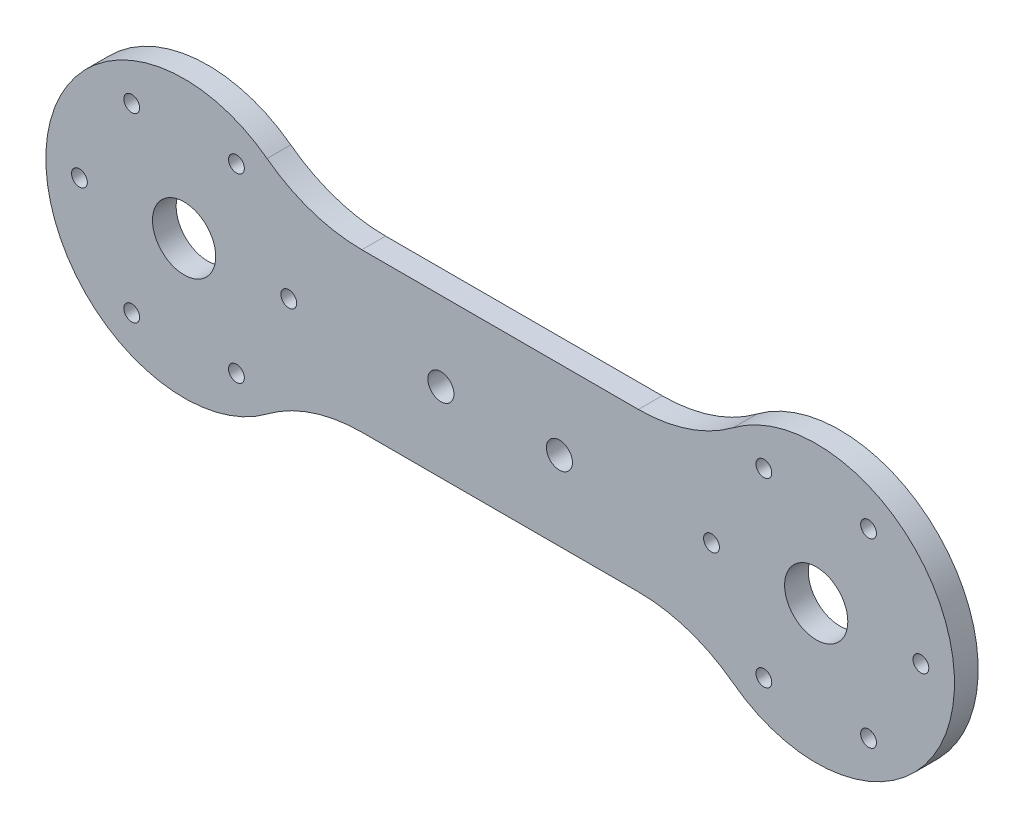
ISO-10303-21;
HEADER;
FILE_DESCRIPTION(('STEP AP214'),'2;1');
FILE_NAME('part.step','',(''),(''),'','','');
FILE_SCHEMA(('AUTOMOTIVE_DESIGN { 1 0 10303 214 1 1 1 1 }'));
ENDSEC;
DATA;
#1=APPLICATION_CONTEXT('core data for automotive mechanical design processes');
#2=APPLICATION_PROTOCOL_DEFINITION('international standard','automotive_design',2000,#1);
#3=PRODUCT_CONTEXT('',#1,'mechanical');
#4=PRODUCT('Part','Part','',(#3));
#5=PRODUCT_RELATED_PRODUCT_CATEGORY('part','',(#4));
#6=PRODUCT_DEFINITION_FORMATION('','',#4);
#7=PRODUCT_DEFINITION_CONTEXT('part definition',#1,'design');
#8=PRODUCT_DEFINITION('design','',#6,#7);
#9=PRODUCT_DEFINITION_SHAPE('','',#8);
#10=(LENGTH_UNIT() NAMED_UNIT(*) SI_UNIT(.MILLI.,.METRE.));
#11=(NAMED_UNIT(*) PLANE_ANGLE_UNIT() SI_UNIT($,.RADIAN.));
#12=(NAMED_UNIT(*) SI_UNIT($,.STERADIAN.) SOLID_ANGLE_UNIT());
#13=UNCERTAINTY_MEASURE_WITH_UNIT(LENGTH_MEASURE(1.E-05),#10,'distance_accuracy_value','');
#14=(GEOMETRIC_REPRESENTATION_CONTEXT(3) GLOBAL_UNCERTAINTY_ASSIGNED_CONTEXT((#13)) GLOBAL_UNIT_ASSIGNED_CONTEXT((#10,
#11,#12)) REPRESENTATION_CONTEXT('',''));
#15=CARTESIAN_POINT('',(0.,0.,0.));
#16=DIRECTION('',(0.,0.,1.));
#17=DIRECTION('',(1.,0.,0.));
#18=AXIS2_PLACEMENT_3D('',#15,#16,#17);
#19=CARTESIAN_POINT('',(80.,0.,3.));
#20=DIRECTION('',(0.,0.,-1.));
#21=DIRECTION('',(-1.,0.,0.));
#22=AXIS2_PLACEMENT_3D('',#19,#20,#21);
#23=CYLINDRICAL_SURFACE('',#22,17.5);
#24=CARTESIAN_POINT('',(80.,0.,3.));
#25=DIRECTION('',(0.,0.,1.));
#26=DIRECTION('',(1.,0.,0.));
#27=AXIS2_PLACEMENT_3D('',#24,#25,#26);
#28=CIRCLE('',#27,17.5);
#29=CARTESIAN_POINT('',(69.5,14.,3.));
#30=VERTEX_POINT('',#29);
#31=CARTESIAN_POINT('',(69.5,-14.,3.));
#32=VERTEX_POINT('',#31);
#33=EDGE_CURVE('E174',#30,#32,#28,.F.);
#34=ORIENTED_EDGE('',*,*,#33,.T.);
#35=DIRECTION('',(0.,0.,-1.));
#36=VECTOR('',#35,1.);
#37=CARTESIAN_POINT('',(69.5,-14.,3.));
#38=LINE('',#37,#36);
#39=CARTESIAN_POINT('',(69.5,-14.,0.));
#40=VERTEX_POINT('',#39);
#41=EDGE_CURVE('E146',#32,#40,#38,.T.);
#42=ORIENTED_EDGE('',*,*,#41,.T.);
#43=CARTESIAN_POINT('',(80.,0.,0.));
#44=DIRECTION('',(0.,0.,1.));
#45=DIRECTION('',(1.,0.,0.));
#46=AXIS2_PLACEMENT_3D('',#43,#44,#45);
#47=CIRCLE('',#46,17.5);
#48=CARTESIAN_POINT('',(69.5,14.,0.));
#49=VERTEX_POINT('',#48);
#50=EDGE_CURVE('E162',#49,#40,#47,.F.);
#51=ORIENTED_EDGE('',*,*,#50,.F.);
#52=DIRECTION('',(0.,0.,-1.));
#53=VECTOR('',#52,1.);
#54=CARTESIAN_POINT('',(69.5,14.,3.));
#55=LINE('',#54,#53);
#56=EDGE_CURVE('E144',#49,#30,#55,.F.);
#57=ORIENTED_EDGE('',*,*,#56,.T.);
#58=EDGE_LOOP('',(#34,#42,#51,#57));
#59=FACE_BOUND('',#58,.T.);
#60=ADVANCED_FACE('F34',(#59),#23,.T.);
#61=CARTESIAN_POINT('',(0.,10.,3.));
#62=DIRECTION('',(0.,1.,0.));
#63=DIRECTION('',(0.,0.,1.));
#64=AXIS2_PLACEMENT_3D('',#61,#62,#63);
#65=PLANE('',#64);
#66=DIRECTION('',(1.,0.,0.));
#67=VECTOR('',#66,1.);
#68=CARTESIAN_POINT('',(0.,10.,3.));
#69=LINE('',#68,#67);
#70=CARTESIAN_POINT('',(22.5,10.,3.));
#71=VERTEX_POINT('',#70);
#72=CARTESIAN_POINT('',(57.5,10.,3.));
#73=VERTEX_POINT('',#72);
#74=EDGE_CURVE('E169',#71,#73,#69,.T.);
#75=ORIENTED_EDGE('',*,*,#74,.T.);
#76=DIRECTION('',(0.,0.,1.));
#77=VECTOR('',#76,1.);
#78=CARTESIAN_POINT('',(57.5,10.,0.));
#79=LINE('',#78,#77);
#80=CARTESIAN_POINT('',(57.5,10.,0.));
#81=VERTEX_POINT('',#80);
#82=EDGE_CURVE('E111',#73,#81,#79,.F.);
#83=ORIENTED_EDGE('',*,*,#82,.T.);
#84=DIRECTION('',(1.,0.,0.));
#85=VECTOR('',#84,1.);
#86=CARTESIAN_POINT('',(0.,10.,0.));
#87=LINE('',#86,#85);
#88=CARTESIAN_POINT('',(22.5,10.,0.));
#89=VERTEX_POINT('',#88);
#90=EDGE_CURVE('E135',#89,#81,#87,.T.);
#91=ORIENTED_EDGE('',*,*,#90,.F.);
#92=DIRECTION('',(0.,0.,-1.));
#93=VECTOR('',#92,1.);
#94=CARTESIAN_POINT('',(22.5,10.,3.));
#95=LINE('',#94,#93);
#96=EDGE_CURVE('E56',#89,#71,#95,.F.);
#97=ORIENTED_EDGE('',*,*,#96,.T.);
#98=EDGE_LOOP('',(#75,#83,#91,#97));
#99=FACE_BOUND('',#98,.T.);
#100=ADVANCED_FACE('F160',(#99),#65,.T.);
#101=CARTESIAN_POINT('',(0.,0.,3.));
#102=DIRECTION('',(0.,0.,-1.));
#103=DIRECTION('',(-1.,0.,0.));
#104=AXIS2_PLACEMENT_3D('',#101,#102,#103);
#105=CYLINDRICAL_SURFACE('',#104,17.5);
#106=CARTESIAN_POINT('',(0.,0.,0.));
#107=DIRECTION('',(0.,0.,1.));
#108=DIRECTION('',(1.,0.,0.));
#109=AXIS2_PLACEMENT_3D('',#106,#107,#108);
#110=CIRCLE('',#109,17.5);
#111=CARTESIAN_POINT('',(10.5,14.,0.));
#112=VERTEX_POINT('',#111);
#113=CARTESIAN_POINT('',(10.5,-14.,0.));
#114=VERTEX_POINT('',#113);
#115=EDGE_CURVE('E130',#112,#114,#110,.T.);
#116=ORIENTED_EDGE('',*,*,#115,.T.);
#117=DIRECTION('',(0.,0.,-1.));
#118=VECTOR('',#117,1.);
#119=CARTESIAN_POINT('',(10.5,-14.,3.));
#120=LINE('',#119,#118);
#121=CARTESIAN_POINT('',(10.5,-14.,3.));
#122=VERTEX_POINT('',#121);
#123=EDGE_CURVE('E105',#114,#122,#120,.F.);
#124=ORIENTED_EDGE('',*,*,#123,.T.);
#125=CARTESIAN_POINT('',(0.,0.,3.));
#126=DIRECTION('',(0.,0.,1.));
#127=DIRECTION('',(1.,0.,0.));
#128=AXIS2_PLACEMENT_3D('',#125,#126,#127);
#129=CIRCLE('',#128,17.5);
#130=CARTESIAN_POINT('',(10.5,14.,3.));
#131=VERTEX_POINT('',#130);
#132=EDGE_CURVE('E168',#131,#122,#129,.T.);
#133=ORIENTED_EDGE('',*,*,#132,.F.);
#134=DIRECTION('',(0.,0.,-1.));
#135=VECTOR('',#134,1.);
#136=CARTESIAN_POINT('',(10.5,14.,3.));
#137=LINE('',#136,#135);
#138=EDGE_CURVE('E121',#131,#112,#137,.T.);
#139=ORIENTED_EDGE('',*,*,#138,.T.);
#140=EDGE_LOOP('',(#116,#124,#133,#139));
#141=FACE_BOUND('',#140,.T.);
#142=ADVANCED_FACE('F171',(#141),#105,.T.);
#143=CARTESIAN_POINT('',(0.,-10.,3.));
#144=DIRECTION('',(0.,1.,0.));
#145=DIRECTION('',(0.,0.,1.));
#146=AXIS2_PLACEMENT_3D('',#143,#144,#145);
#147=PLANE('',#146);
#148=DIRECTION('',(1.,0.,0.));
#149=VECTOR('',#148,1.);
#150=CARTESIAN_POINT('',(0.,-10.,3.));
#151=LINE('',#150,#149);
#152=CARTESIAN_POINT('',(22.5,-10.,3.));
#153=VERTEX_POINT('',#152);
#154=CARTESIAN_POINT('',(57.5,-10.,3.));
#155=VERTEX_POINT('',#154);
#156=EDGE_CURVE('E120',#153,#155,#151,.T.);
#157=ORIENTED_EDGE('',*,*,#156,.F.);
#158=DIRECTION('',(0.,0.,1.));
#159=VECTOR('',#158,1.);
#160=CARTESIAN_POINT('',(22.5,-10.,0.));
#161=LINE('',#160,#159);
#162=CARTESIAN_POINT('',(22.5,-10.,0.));
#163=VERTEX_POINT('',#162);
#164=EDGE_CURVE('E104',#153,#163,#161,.F.);
#165=ORIENTED_EDGE('',*,*,#164,.T.);
#166=DIRECTION('',(1.,0.,0.));
#167=VECTOR('',#166,1.);
#168=CARTESIAN_POINT('',(0.,-10.,0.));
#169=LINE('',#168,#167);
#170=CARTESIAN_POINT('',(57.5,-10.,0.));
#171=VERTEX_POINT('',#170);
#172=EDGE_CURVE('E117',#163,#171,#169,.T.);
#173=ORIENTED_EDGE('',*,*,#172,.T.);
#174=DIRECTION('',(0.,0.,-1.));
#175=VECTOR('',#174,1.);
#176=CARTESIAN_POINT('',(57.5,-10.,3.));
#177=LINE('',#176,#175);
#178=EDGE_CURVE('E122',#171,#155,#177,.F.);
#179=ORIENTED_EDGE('',*,*,#178,.T.);
#180=EDGE_LOOP('',(#157,#165,#173,#179));
#181=FACE_BOUND('',#180,.T.);
#182=ADVANCED_FACE('F116',(#181),#147,.F.);
#183=CARTESIAN_POINT('',(73.375,11.4748366001438,3.));
#184=DIRECTION('',(0.,0.,-1.));
#185=DIRECTION('',(-1.,0.,0.));
#186=AXIS2_PLACEMENT_3D('',#183,#184,#185);
#187=CYLINDRICAL_SURFACE('',#186,0.999999999999993);
#188=CARTESIAN_POINT('',(73.375,11.4748366001438,3.));
#189=DIRECTION('',(0.,0.,1.));
#190=DIRECTION('',(1.,0.,0.));
#191=AXIS2_PLACEMENT_3D('',#188,#189,#190);
#192=CIRCLE('',#191,0.999999999999993);
#193=CARTESIAN_POINT('',(74.3749999999999,11.4748366001438,3.));
#194=VERTEX_POINT('',#193);
#195=EDGE_CURVE('E608',#194,#194,#192,.F.);
#196=ORIENTED_EDGE('',*,*,#195,.F.);
#197=EDGE_LOOP('',(#196));
#198=FACE_BOUND('',#197,.T.);
#199=CARTESIAN_POINT('',(73.375,11.4748366001438,0.));
#200=DIRECTION('',(0.,0.,1.));
#201=DIRECTION('',(1.,0.,0.));
#202=AXIS2_PLACEMENT_3D('',#199,#200,#201);
#203=CIRCLE('',#202,0.999999999999993);
#204=CARTESIAN_POINT('',(74.3749999999999,11.4748366001438,0.));
#205=VERTEX_POINT('',#204);
#206=EDGE_CURVE('E222',#205,#205,#203,.F.);
#207=ORIENTED_EDGE('',*,*,#206,.T.);
#208=EDGE_LOOP('',(#207));
#209=FACE_BOUND('',#208,.T.);
#210=ADVANCED_FACE('F248',(#198,#209),#187,.F.);
#211=CARTESIAN_POINT('',(73.3750000000001,-11.4748366001439,3.));
#212=DIRECTION('',(0.,0.,-1.));
#213=DIRECTION('',(-1.,0.,0.));
#214=AXIS2_PLACEMENT_3D('',#211,#212,#213);
#215=CYLINDRICAL_SURFACE('',#214,0.999999999999993);
#216=CARTESIAN_POINT('',(73.3750000000001,-11.4748366001439,3.));
#217=DIRECTION('',(0.,0.,1.));
#218=DIRECTION('',(1.,0.,0.));
#219=AXIS2_PLACEMENT_3D('',#216,#217,#218);
#220=CIRCLE('',#219,0.999999999999993);
#221=CARTESIAN_POINT('',(74.3750000000001,-11.4748366001439,3.));
#222=VERTEX_POINT('',#221);
#223=EDGE_CURVE('E605',#222,#222,#220,.F.);
#224=ORIENTED_EDGE('',*,*,#223,.F.);
#225=EDGE_LOOP('',(#224));
#226=FACE_BOUND('',#225,.T.);
#227=CARTESIAN_POINT('',(73.3750000000001,-11.4748366001439,0.));
#228=DIRECTION('',(0.,0.,1.));
#229=DIRECTION('',(1.,0.,0.));
#230=AXIS2_PLACEMENT_3D('',#227,#228,#229);
#231=CIRCLE('',#230,0.999999999999993);
#232=CARTESIAN_POINT('',(74.3750000000001,-11.4748366001439,0.));
#233=VERTEX_POINT('',#232);
#234=EDGE_CURVE('E219',#233,#233,#231,.F.);
#235=ORIENTED_EDGE('',*,*,#234,.T.);
#236=EDGE_LOOP('',(#235));
#237=FACE_BOUND('',#236,.T.);
#238=ADVANCED_FACE('F251',(#226,#237),#215,.F.);
#239=CARTESIAN_POINT('',(-6.62500000000014,-11.4748366001437,3.));
#240=DIRECTION('',(0.,0.,-1.));
#241=DIRECTION('',(-1.,0.,0.));
#242=AXIS2_PLACEMENT_3D('',#239,#240,#241);
#243=CYLINDRICAL_SURFACE('',#242,0.999999999999995);
#244=CARTESIAN_POINT('',(-6.62500000000014,-11.4748366001437,3.));
#245=DIRECTION('',(0.,0.,1.));
#246=DIRECTION('',(1.,0.,0.));
#247=AXIS2_PLACEMENT_3D('',#244,#245,#246);
#248=CIRCLE('',#247,0.999999999999995);
#249=CARTESIAN_POINT('',(-5.62500000000014,-11.4748366001437,3.));
#250=VERTEX_POINT('',#249);
#251=EDGE_CURVE('E601',#250,#250,#248,.T.);
#252=ORIENTED_EDGE('',*,*,#251,.T.);
#253=EDGE_LOOP('',(#252));
#254=FACE_BOUND('',#253,.T.);
#255=CARTESIAN_POINT('',(-6.62500000000014,-11.4748366001437,0.));
#256=DIRECTION('',(0.,0.,1.));
#257=DIRECTION('',(1.,0.,0.));
#258=AXIS2_PLACEMENT_3D('',#255,#256,#257);
#259=CIRCLE('',#258,0.999999999999995);
#260=CARTESIAN_POINT('',(-5.62500000000014,-11.4748366001437,0.));
#261=VERTEX_POINT('',#260);
#262=EDGE_CURVE('E216',#261,#261,#259,.T.);
#263=ORIENTED_EDGE('',*,*,#262,.F.);
#264=EDGE_LOOP('',(#263));
#265=FACE_BOUND('',#264,.T.);
#266=ADVANCED_FACE('F255',(#254,#265),#243,.F.);
#267=CARTESIAN_POINT('',(6.62499999999989,-11.4748366001439,3.));
#268=DIRECTION('',(0.,0.,-1.));
#269=DIRECTION('',(-1.,0.,0.));
#270=AXIS2_PLACEMENT_3D('',#267,#268,#269);
#271=CYLINDRICAL_SURFACE('',#270,0.999999999999998);
#272=CARTESIAN_POINT('',(6.62499999999989,-11.4748366001439,3.));
#273=DIRECTION('',(0.,0.,1.));
#274=DIRECTION('',(1.,0.,0.));
#275=AXIS2_PLACEMENT_3D('',#272,#273,#274);
#276=CIRCLE('',#275,0.999999999999998);
#277=CARTESIAN_POINT('',(7.62499999999989,-11.4748366001439,3.));
#278=VERTEX_POINT('',#277);
#279=EDGE_CURVE('E597',#278,#278,#276,.T.);
#280=ORIENTED_EDGE('',*,*,#279,.T.);
#281=EDGE_LOOP('',(#280));
#282=FACE_BOUND('',#281,.T.);
#283=CARTESIAN_POINT('',(6.62499999999989,-11.4748366001439,0.));
#284=DIRECTION('',(0.,0.,1.));
#285=DIRECTION('',(1.,0.,0.));
#286=AXIS2_PLACEMENT_3D('',#283,#284,#285);
#287=CIRCLE('',#286,0.999999999999998);
#288=CARTESIAN_POINT('',(7.62499999999989,-11.4748366001439,0.));
#289=VERTEX_POINT('',#288);
#290=EDGE_CURVE('E213',#289,#289,#287,.T.);
#291=ORIENTED_EDGE('',*,*,#290,.F.);
#292=EDGE_LOOP('',(#291));
#293=FACE_BOUND('',#292,.T.);
#294=ADVANCED_FACE('F259',(#282,#293),#271,.F.);
#295=CARTESIAN_POINT('',(13.25,0.,3.));
#296=DIRECTION('',(0.,0.,-1.));
#297=DIRECTION('',(-1.,0.,0.));
#298=AXIS2_PLACEMENT_3D('',#295,#296,#297);
#299=CYLINDRICAL_SURFACE('',#298,0.999999999999998);
#300=CARTESIAN_POINT('',(13.25,0.,3.));
#301=DIRECTION('',(0.,0.,1.));
#302=DIRECTION('',(1.,0.,0.));
#303=AXIS2_PLACEMENT_3D('',#300,#301,#302);
#304=CIRCLE('',#303,0.999999999999998);
#305=CARTESIAN_POINT('',(14.25,0.,3.));
#306=VERTEX_POINT('',#305);
#307=EDGE_CURVE('E593',#306,#306,#304,.T.);
#308=ORIENTED_EDGE('',*,*,#307,.T.);
#309=EDGE_LOOP('',(#308));
#310=FACE_BOUND('',#309,.T.);
#311=CARTESIAN_POINT('',(13.25,0.,0.));
#312=DIRECTION('',(0.,0.,1.));
#313=DIRECTION('',(1.,0.,0.));
#314=AXIS2_PLACEMENT_3D('',#311,#312,#313);
#315=CIRCLE('',#314,0.999999999999998);
#316=CARTESIAN_POINT('',(14.25,0.,0.));
#317=VERTEX_POINT('',#316);
#318=EDGE_CURVE('E210',#317,#317,#315,.T.);
#319=ORIENTED_EDGE('',*,*,#318,.F.);
#320=EDGE_LOOP('',(#319));
#321=FACE_BOUND('',#320,.T.);
#322=ADVANCED_FACE('F263',(#310,#321),#299,.F.);
#323=CARTESIAN_POINT('',(86.6250000000001,-11.4748366001437,3.));
#324=DIRECTION('',(0.,0.,-1.));
#325=DIRECTION('',(-1.,0.,0.));
#326=AXIS2_PLACEMENT_3D('',#323,#324,#325);
#327=CYLINDRICAL_SURFACE('',#326,0.999999999999999);
#328=CARTESIAN_POINT('',(86.6250000000001,-11.4748366001437,3.));
#329=DIRECTION('',(0.,0.,1.));
#330=DIRECTION('',(1.,0.,0.));
#331=AXIS2_PLACEMENT_3D('',#328,#329,#330);
#332=CIRCLE('',#331,0.999999999999999);
#333=CARTESIAN_POINT('',(87.6250000000001,-11.4748366001437,3.));
#334=VERTEX_POINT('',#333);
#335=EDGE_CURVE('E589',#334,#334,#332,.F.);
#336=ORIENTED_EDGE('',*,*,#335,.F.);
#337=EDGE_LOOP('',(#336));
#338=FACE_BOUND('',#337,.T.);
#339=CARTESIAN_POINT('',(86.6250000000001,-11.4748366001437,0.));
#340=DIRECTION('',(0.,0.,1.));
#341=DIRECTION('',(1.,0.,0.));
#342=AXIS2_PLACEMENT_3D('',#339,#340,#341);
#343=CIRCLE('',#342,0.999999999999999);
#344=CARTESIAN_POINT('',(87.6250000000001,-11.4748366001437,0.));
#345=VERTEX_POINT('',#344);
#346=EDGE_CURVE('E207',#345,#345,#343,.F.);
#347=ORIENTED_EDGE('',*,*,#346,.T.);
#348=EDGE_LOOP('',(#347));
#349=FACE_BOUND('',#348,.T.);
#350=ADVANCED_FACE('F267',(#338,#349),#327,.F.);
#351=CARTESIAN_POINT('',(-6.62499999999997,11.4748366001438,3.));
#352=DIRECTION('',(0.,0.,-1.));
#353=DIRECTION('',(-1.,0.,0.));
#354=AXIS2_PLACEMENT_3D('',#351,#352,#353);
#355=CYLINDRICAL_SURFACE('',#354,0.999999999999999);
#356=CARTESIAN_POINT('',(-6.62499999999997,11.4748366001438,3.));
#357=DIRECTION('',(0.,0.,1.));
#358=DIRECTION('',(1.,0.,0.));
#359=AXIS2_PLACEMENT_3D('',#356,#357,#358);
#360=CIRCLE('',#359,0.999999999999999);
#361=CARTESIAN_POINT('',(-5.62499999999997,11.4748366001438,3.));
#362=VERTEX_POINT('',#361);
#363=EDGE_CURVE('E585',#362,#362,#360,.T.);
#364=ORIENTED_EDGE('',*,*,#363,.T.);
#365=EDGE_LOOP('',(#364));
#366=FACE_BOUND('',#365,.T.);
#367=CARTESIAN_POINT('',(-6.62499999999997,11.4748366001438,0.));
#368=DIRECTION('',(0.,0.,1.));
#369=DIRECTION('',(1.,0.,0.));
#370=AXIS2_PLACEMENT_3D('',#367,#368,#369);
#371=CIRCLE('',#370,0.999999999999999);
#372=CARTESIAN_POINT('',(-5.62499999999997,11.4748366001438,0.));
#373=VERTEX_POINT('',#372);
#374=EDGE_CURVE('E204',#373,#373,#371,.T.);
#375=ORIENTED_EDGE('',*,*,#374,.F.);
#376=EDGE_LOOP('',(#375));
#377=FACE_BOUND('',#376,.T.);
#378=ADVANCED_FACE('F271',(#366,#377),#355,.F.);
#379=CARTESIAN_POINT('',(-13.25,0.,3.));
#380=DIRECTION('',(0.,0.,-1.));
#381=DIRECTION('',(-1.,0.,0.));
#382=AXIS2_PLACEMENT_3D('',#379,#380,#381);
#383=CYLINDRICAL_SURFACE('',#382,0.999999999999998);
#384=CARTESIAN_POINT('',(-13.25,0.,3.));
#385=DIRECTION('',(0.,0.,1.));
#386=DIRECTION('',(1.,0.,0.));
#387=AXIS2_PLACEMENT_3D('',#384,#385,#386);
#388=CIRCLE('',#387,0.999999999999998);
#389=CARTESIAN_POINT('',(-12.25,0.,3.));
#390=VERTEX_POINT('',#389);
#391=EDGE_CURVE('E581',#390,#390,#388,.T.);
#392=ORIENTED_EDGE('',*,*,#391,.T.);
#393=EDGE_LOOP('',(#392));
#394=FACE_BOUND('',#393,.T.);
#395=CARTESIAN_POINT('',(-13.25,0.,0.));
#396=DIRECTION('',(0.,0.,1.));
#397=DIRECTION('',(1.,0.,0.));
#398=AXIS2_PLACEMENT_3D('',#395,#396,#397);
#399=CIRCLE('',#398,0.999999999999998);
#400=CARTESIAN_POINT('',(-12.25,0.,0.));
#401=VERTEX_POINT('',#400);
#402=EDGE_CURVE('E201',#401,#401,#399,.T.);
#403=ORIENTED_EDGE('',*,*,#402,.F.);
#404=EDGE_LOOP('',(#403));
#405=FACE_BOUND('',#404,.T.);
#406=ADVANCED_FACE('F275',(#394,#405),#383,.F.);
#407=CARTESIAN_POINT('',(0.,0.,3.));
#408=DIRECTION('',(0.,0.,-1.));
#409=DIRECTION('',(-1.,0.,0.));
#410=AXIS2_PLACEMENT_3D('',#407,#408,#409);
#411=CYLINDRICAL_SURFACE('',#410,4.);
#412=CARTESIAN_POINT('',(0.,0.,3.));
#413=DIRECTION('',(0.,0.,1.));
#414=DIRECTION('',(1.,0.,0.));
#415=AXIS2_PLACEMENT_3D('',#412,#413,#414);
#416=CIRCLE('',#415,4.);
#417=CARTESIAN_POINT('',(4.,0.,3.));
#418=VERTEX_POINT('',#417);
#419=EDGE_CURVE('E577',#418,#418,#416,.T.);
#420=ORIENTED_EDGE('',*,*,#419,.T.);
#421=EDGE_LOOP('',(#420));
#422=FACE_BOUND('',#421,.T.);
#423=CARTESIAN_POINT('',(0.,0.,0.));
#424=DIRECTION('',(0.,0.,1.));
#425=DIRECTION('',(1.,0.,0.));
#426=AXIS2_PLACEMENT_3D('',#423,#424,#425);
#427=CIRCLE('',#426,4.);
#428=CARTESIAN_POINT('',(4.,0.,0.));
#429=VERTEX_POINT('',#428);
#430=EDGE_CURVE('E198',#429,#429,#427,.T.);
#431=ORIENTED_EDGE('',*,*,#430,.F.);
#432=EDGE_LOOP('',(#431));
#433=FACE_BOUND('',#432,.T.);
#434=ADVANCED_FACE('F279',(#422,#433),#411,.F.);
#435=CARTESIAN_POINT('',(6.62500000000006,11.4748366001438,3.));
#436=DIRECTION('',(0.,0.,-1.));
#437=DIRECTION('',(-1.,0.,0.));
#438=AXIS2_PLACEMENT_3D('',#435,#436,#437);
#439=CYLINDRICAL_SURFACE('',#438,0.999999999999997);
#440=CARTESIAN_POINT('',(6.62500000000006,11.4748366001438,3.));
#441=DIRECTION('',(0.,0.,1.));
#442=DIRECTION('',(1.,0.,0.));
#443=AXIS2_PLACEMENT_3D('',#440,#441,#442);
#444=CIRCLE('',#443,0.999999999999997);
#445=CARTESIAN_POINT('',(7.62500000000005,11.4748366001438,3.));
#446=VERTEX_POINT('',#445);
#447=EDGE_CURVE('E573',#446,#446,#444,.T.);
#448=ORIENTED_EDGE('',*,*,#447,.T.);
#449=EDGE_LOOP('',(#448));
#450=FACE_BOUND('',#449,.T.);
#451=CARTESIAN_POINT('',(6.62500000000006,11.4748366001438,0.));
#452=DIRECTION('',(0.,0.,1.));
#453=DIRECTION('',(1.,0.,0.));
#454=AXIS2_PLACEMENT_3D('',#451,#452,#453);
#455=CIRCLE('',#454,0.999999999999997);
#456=CARTESIAN_POINT('',(7.62500000000005,11.4748366001438,0.));
#457=VERTEX_POINT('',#456);
#458=EDGE_CURVE('E195',#457,#457,#455,.T.);
#459=ORIENTED_EDGE('',*,*,#458,.F.);
#460=EDGE_LOOP('',(#459));
#461=FACE_BOUND('',#460,.T.);
#462=ADVANCED_FACE('F283',(#450,#461),#439,.F.);
#463=CARTESIAN_POINT('',(80.,0.,3.));
#464=DIRECTION('',(0.,0.,-1.));
#465=DIRECTION('',(-1.,0.,0.));
#466=AXIS2_PLACEMENT_3D('',#463,#464,#465);
#467=CYLINDRICAL_SURFACE('',#466,4.);
#468=CARTESIAN_POINT('',(80.,0.,3.));
#469=DIRECTION('',(0.,0.,1.));
#470=DIRECTION('',(1.,0.,0.));
#471=AXIS2_PLACEMENT_3D('',#468,#469,#470);
#472=CIRCLE('',#471,4.);
#473=CARTESIAN_POINT('',(84.,0.,3.));
#474=VERTEX_POINT('',#473);
#475=EDGE_CURVE('E569',#474,#474,#472,.F.);
#476=ORIENTED_EDGE('',*,*,#475,.F.);
#477=EDGE_LOOP('',(#476));
#478=FACE_BOUND('',#477,.T.);
#479=CARTESIAN_POINT('',(80.,0.,0.));
#480=DIRECTION('',(0.,0.,1.));
#481=DIRECTION('',(1.,0.,0.));
#482=AXIS2_PLACEMENT_3D('',#479,#480,#481);
#483=CIRCLE('',#482,4.);
#484=CARTESIAN_POINT('',(84.,0.,0.));
#485=VERTEX_POINT('',#484);
#486=EDGE_CURVE('E192',#485,#485,#483,.F.);
#487=ORIENTED_EDGE('',*,*,#486,.T.);
#488=EDGE_LOOP('',(#487));
#489=FACE_BOUND('',#488,.T.);
#490=ADVANCED_FACE('F287',(#478,#489),#467,.F.);
#491=CARTESIAN_POINT('',(66.75,0.,3.));
#492=DIRECTION('',(0.,0.,-1.));
#493=DIRECTION('',(-1.,0.,0.));
#494=AXIS2_PLACEMENT_3D('',#491,#492,#493);
#495=CYLINDRICAL_SURFACE('',#494,0.999999999999996);
#496=CARTESIAN_POINT('',(66.75,0.,3.));
#497=DIRECTION('',(0.,0.,1.));
#498=DIRECTION('',(1.,0.,0.));
#499=AXIS2_PLACEMENT_3D('',#496,#497,#498);
#500=CIRCLE('',#499,0.999999999999996);
#501=CARTESIAN_POINT('',(67.75,0.,3.));
#502=VERTEX_POINT('',#501);
#503=EDGE_CURVE('E565',#502,#502,#500,.F.);
#504=ORIENTED_EDGE('',*,*,#503,.F.);
#505=EDGE_LOOP('',(#504));
#506=FACE_BOUND('',#505,.T.);
#507=CARTESIAN_POINT('',(66.75,0.,0.));
#508=DIRECTION('',(0.,0.,1.));
#509=DIRECTION('',(1.,0.,0.));
#510=AXIS2_PLACEMENT_3D('',#507,#508,#509);
#511=CIRCLE('',#510,0.999999999999996);
#512=CARTESIAN_POINT('',(67.75,0.,0.));
#513=VERTEX_POINT('',#512);
#514=EDGE_CURVE('E189',#513,#513,#511,.F.);
#515=ORIENTED_EDGE('',*,*,#514,.T.);
#516=EDGE_LOOP('',(#515));
#517=FACE_BOUND('',#516,.T.);
#518=ADVANCED_FACE('F291',(#506,#517),#495,.F.);
#519=CARTESIAN_POINT('',(86.625,11.4748366001438,3.));
#520=DIRECTION('',(0.,0.,-1.));
#521=DIRECTION('',(-1.,0.,0.));
#522=AXIS2_PLACEMENT_3D('',#519,#520,#521);
#523=CYLINDRICAL_SURFACE('',#522,0.99999999999999);
#524=CARTESIAN_POINT('',(86.625,11.4748366001438,3.));
#525=DIRECTION('',(0.,0.,1.));
#526=DIRECTION('',(1.,0.,0.));
#527=AXIS2_PLACEMENT_3D('',#524,#525,#526);
#528=CIRCLE('',#527,0.99999999999999);
#529=CARTESIAN_POINT('',(87.625,11.4748366001438,3.));
#530=VERTEX_POINT('',#529);
#531=EDGE_CURVE('E561',#530,#530,#528,.F.);
#532=ORIENTED_EDGE('',*,*,#531,.F.);
#533=EDGE_LOOP('',(#532));
#534=FACE_BOUND('',#533,.T.);
#535=CARTESIAN_POINT('',(86.625,11.4748366001438,0.));
#536=DIRECTION('',(0.,0.,1.));
#537=DIRECTION('',(1.,0.,0.));
#538=AXIS2_PLACEMENT_3D('',#535,#536,#537);
#539=CIRCLE('',#538,0.99999999999999);
#540=CARTESIAN_POINT('',(87.625,11.4748366001438,0.));
#541=VERTEX_POINT('',#540);
#542=EDGE_CURVE('E186',#541,#541,#539,.F.);
#543=ORIENTED_EDGE('',*,*,#542,.T.);
#544=EDGE_LOOP('',(#543));
#545=FACE_BOUND('',#544,.T.);
#546=ADVANCED_FACE('F295',(#534,#545),#523,.F.);
#547=CARTESIAN_POINT('',(32.5,0.,3.));
#548=DIRECTION('',(0.,0.,-1.));
#549=DIRECTION('',(-1.,0.,0.));
#550=AXIS2_PLACEMENT_3D('',#547,#548,#549);
#551=CYLINDRICAL_SURFACE('',#550,1.65);
#552=CARTESIAN_POINT('',(32.5,0.,3.));
#553=DIRECTION('',(0.,0.,1.));
#554=DIRECTION('',(1.,0.,0.));
#555=AXIS2_PLACEMENT_3D('',#552,#553,#554);
#556=CIRCLE('',#555,1.65);
#557=CARTESIAN_POINT('',(34.15,0.,3.));
#558=VERTEX_POINT('',#557);
#559=EDGE_CURVE('E557',#558,#558,#556,.T.);
#560=ORIENTED_EDGE('',*,*,#559,.T.);
#561=EDGE_LOOP('',(#560));
#562=FACE_BOUND('',#561,.T.);
#563=CARTESIAN_POINT('',(32.5,0.,0.));
#564=DIRECTION('',(0.,0.,1.));
#565=DIRECTION('',(1.,0.,0.));
#566=AXIS2_PLACEMENT_3D('',#563,#564,#565);
#567=CIRCLE('',#566,1.65);
#568=CARTESIAN_POINT('',(34.15,0.,0.));
#569=VERTEX_POINT('',#568);
#570=EDGE_CURVE('E183',#569,#569,#567,.T.);
#571=ORIENTED_EDGE('',*,*,#570,.F.);
#572=EDGE_LOOP('',(#571));
#573=FACE_BOUND('',#572,.T.);
#574=ADVANCED_FACE('F299',(#562,#573),#551,.F.);
#575=CARTESIAN_POINT('',(47.5,0.,3.));
#576=DIRECTION('',(0.,0.,-1.));
#577=DIRECTION('',(-1.,0.,0.));
#578=AXIS2_PLACEMENT_3D('',#575,#576,#577);
#579=CYLINDRICAL_SURFACE('',#578,1.65);
#580=CARTESIAN_POINT('',(47.5,0.,3.));
#581=DIRECTION('',(0.,0.,1.));
#582=DIRECTION('',(1.,0.,0.));
#583=AXIS2_PLACEMENT_3D('',#580,#581,#582);
#584=CIRCLE('',#583,1.65);
#585=CARTESIAN_POINT('',(49.15,0.,3.));
#586=VERTEX_POINT('',#585);
#587=EDGE_CURVE('E133',#586,#586,#584,.T.);
#588=ORIENTED_EDGE('',*,*,#587,.T.);
#589=EDGE_LOOP('',(#588));
#590=FACE_BOUND('',#589,.T.);
#591=CARTESIAN_POINT('',(47.5,0.,0.));
#592=DIRECTION('',(0.,0.,1.));
#593=DIRECTION('',(1.,0.,0.));
#594=AXIS2_PLACEMENT_3D('',#591,#592,#593);
#595=CIRCLE('',#594,1.65);
#596=CARTESIAN_POINT('',(49.15,0.,0.));
#597=VERTEX_POINT('',#596);
#598=EDGE_CURVE('E180',#597,#597,#595,.T.);
#599=ORIENTED_EDGE('',*,*,#598,.F.);
#600=EDGE_LOOP('',(#599));
#601=FACE_BOUND('',#600,.T.);
#602=ADVANCED_FACE('F303',(#590,#601),#579,.F.);
#603=CARTESIAN_POINT('',(93.25,0.,3.));
#604=DIRECTION('',(0.,0.,-1.));
#605=DIRECTION('',(-1.,0.,0.));
#606=AXIS2_PLACEMENT_3D('',#603,#604,#605);
#607=CYLINDRICAL_SURFACE('',#606,0.999999999999998);
#608=CARTESIAN_POINT('',(93.25,0.,3.));
#609=DIRECTION('',(0.,0.,1.));
#610=DIRECTION('',(1.,0.,0.));
#611=AXIS2_PLACEMENT_3D('',#608,#609,#610);
#612=CIRCLE('',#611,0.999999999999998);
#613=CARTESIAN_POINT('',(94.25,0.,3.));
#614=VERTEX_POINT('',#613);
#615=EDGE_CURVE('E139',#614,#614,#612,.F.);
#616=ORIENTED_EDGE('',*,*,#615,.F.);
#617=EDGE_LOOP('',(#616));
#618=FACE_BOUND('',#617,.T.);
#619=CARTESIAN_POINT('',(93.25,0.,0.));
#620=DIRECTION('',(0.,0.,1.));
#621=DIRECTION('',(1.,0.,0.));
#622=AXIS2_PLACEMENT_3D('',#619,#620,#621);
#623=CIRCLE('',#622,0.999999999999998);
#624=CARTESIAN_POINT('',(94.25,0.,0.));
#625=VERTEX_POINT('',#624);
#626=EDGE_CURVE('E129',#625,#625,#623,.F.);
#627=ORIENTED_EDGE('',*,*,#626,.T.);
#628=EDGE_LOOP('',(#627));
#629=FACE_BOUND('',#628,.T.);
#630=ADVANCED_FACE('F307',(#618,#629),#607,.F.);
#631=CARTESIAN_POINT('',(0.,0.,3.));
#632=DIRECTION('',(0.,0.,1.));
#633=DIRECTION('',(1.,0.,0.));
#634=AXIS2_PLACEMENT_3D('',#631,#632,#633);
#635=PLANE('',#634);
#636=ORIENTED_EDGE('',*,*,#587,.F.);
#637=EDGE_LOOP('',(#636));
#638=FACE_BOUND('',#637,.T.);
#639=ORIENTED_EDGE('',*,*,#559,.F.);
#640=EDGE_LOOP('',(#639));
#641=FACE_BOUND('',#640,.T.);
#642=ORIENTED_EDGE('',*,*,#531,.T.);
#643=EDGE_LOOP('',(#642));
#644=FACE_BOUND('',#643,.T.);
#645=ORIENTED_EDGE('',*,*,#503,.T.);
#646=EDGE_LOOP('',(#645));
#647=FACE_BOUND('',#646,.T.);
#648=ORIENTED_EDGE('',*,*,#475,.T.);
#649=EDGE_LOOP('',(#648));
#650=FACE_BOUND('',#649,.T.);
#651=ORIENTED_EDGE('',*,*,#447,.F.);
#652=EDGE_LOOP('',(#651));
#653=FACE_BOUND('',#652,.T.);
#654=ORIENTED_EDGE('',*,*,#419,.F.);
#655=EDGE_LOOP('',(#654));
#656=FACE_BOUND('',#655,.T.);
#657=ORIENTED_EDGE('',*,*,#391,.F.);
#658=EDGE_LOOP('',(#657));
#659=FACE_BOUND('',#658,.T.);
#660=ORIENTED_EDGE('',*,*,#363,.F.);
#661=EDGE_LOOP('',(#660));
#662=FACE_BOUND('',#661,.T.);
#663=ORIENTED_EDGE('',*,*,#335,.T.);
#664=EDGE_LOOP('',(#663));
#665=FACE_BOUND('',#664,.T.);
#666=ORIENTED_EDGE('',*,*,#307,.F.);
#667=EDGE_LOOP('',(#666));
#668=FACE_BOUND('',#667,.T.);
#669=ORIENTED_EDGE('',*,*,#279,.F.);
#670=EDGE_LOOP('',(#669));
#671=FACE_BOUND('',#670,.T.);
#672=ORIENTED_EDGE('',*,*,#251,.F.);
#673=EDGE_LOOP('',(#672));
#674=FACE_BOUND('',#673,.T.);
#675=ORIENTED_EDGE('',*,*,#223,.T.);
#676=EDGE_LOOP('',(#675));
#677=FACE_BOUND('',#676,.T.);
#678=ORIENTED_EDGE('',*,*,#195,.T.);
#679=EDGE_LOOP('',(#678));
#680=FACE_BOUND('',#679,.T.);
#681=ORIENTED_EDGE('',*,*,#33,.F.);
#682=CARTESIAN_POINT('',(57.5,30.,3.));
#683=DIRECTION('',(0.,0.,1.));
#684=DIRECTION('',(1.,0.,0.));
#685=AXIS2_PLACEMENT_3D('',#682,#683,#684);
#686=CIRCLE('',#685,20.);
#687=EDGE_CURVE('E49',#30,#73,#686,.F.);
#688=ORIENTED_EDGE('',*,*,#687,.T.);
#689=ORIENTED_EDGE('',*,*,#74,.F.);
#690=CARTESIAN_POINT('',(22.5,30.,3.));
#691=DIRECTION('',(0.,0.,1.));
#692=DIRECTION('',(1.,0.,0.));
#693=AXIS2_PLACEMENT_3D('',#690,#691,#692);
#694=CIRCLE('',#693,20.);
#695=EDGE_CURVE('E11',#71,#131,#694,.F.);
#696=ORIENTED_EDGE('',*,*,#695,.T.);
#697=ORIENTED_EDGE('',*,*,#132,.T.);
#698=CARTESIAN_POINT('',(22.5,-30.,3.));
#699=DIRECTION('',(0.,0.,1.));
#700=DIRECTION('',(1.,0.,0.));
#701=AXIS2_PLACEMENT_3D('',#698,#699,#700);
#702=CIRCLE('',#701,20.);
#703=EDGE_CURVE('E110',#122,#153,#702,.F.);
#704=ORIENTED_EDGE('',*,*,#703,.T.);
#705=ORIENTED_EDGE('',*,*,#156,.T.);
#706=CARTESIAN_POINT('',(57.5,-30.,3.));
#707=DIRECTION('',(0.,0.,1.));
#708=DIRECTION('',(1.,0.,0.));
#709=AXIS2_PLACEMENT_3D('',#706,#707,#708);
#710=CIRCLE('',#709,20.);
#711=EDGE_CURVE('E154',#155,#32,#710,.F.);
#712=ORIENTED_EDGE('',*,*,#711,.T.);
#713=EDGE_LOOP('',(#681,#688,#689,#696,#697,#704,#705,#712));
#714=FACE_BOUND('',#713,.T.);
#715=ORIENTED_EDGE('',*,*,#615,.T.);
#716=EDGE_LOOP('',(#715));
#717=FACE_BOUND('',#716,.T.);
#718=ADVANCED_FACE('F166',(#638,#641,#644,#647,#650,#653,#656,#659,#662,#665,#668,#671,#674,
#677,#680,#714,#717),#635,.T.);
#719=CARTESIAN_POINT('',(0.,0.,0.));
#720=DIRECTION('',(0.,0.,1.));
#721=DIRECTION('',(1.,0.,0.));
#722=AXIS2_PLACEMENT_3D('',#719,#720,#721);
#723=PLANE('',#722);
#724=ORIENTED_EDGE('',*,*,#598,.T.);
#725=EDGE_LOOP('',(#724));
#726=FACE_BOUND('',#725,.T.);
#727=ORIENTED_EDGE('',*,*,#570,.T.);
#728=EDGE_LOOP('',(#727));
#729=FACE_BOUND('',#728,.T.);
#730=ORIENTED_EDGE('',*,*,#542,.F.);
#731=EDGE_LOOP('',(#730));
#732=FACE_BOUND('',#731,.T.);
#733=ORIENTED_EDGE('',*,*,#514,.F.);
#734=EDGE_LOOP('',(#733));
#735=FACE_BOUND('',#734,.T.);
#736=ORIENTED_EDGE('',*,*,#486,.F.);
#737=EDGE_LOOP('',(#736));
#738=FACE_BOUND('',#737,.T.);
#739=ORIENTED_EDGE('',*,*,#458,.T.);
#740=EDGE_LOOP('',(#739));
#741=FACE_BOUND('',#740,.T.);
#742=ORIENTED_EDGE('',*,*,#430,.T.);
#743=EDGE_LOOP('',(#742));
#744=FACE_BOUND('',#743,.T.);
#745=ORIENTED_EDGE('',*,*,#402,.T.);
#746=EDGE_LOOP('',(#745));
#747=FACE_BOUND('',#746,.T.);
#748=ORIENTED_EDGE('',*,*,#374,.T.);
#749=EDGE_LOOP('',(#748));
#750=FACE_BOUND('',#749,.T.);
#751=ORIENTED_EDGE('',*,*,#346,.F.);
#752=EDGE_LOOP('',(#751));
#753=FACE_BOUND('',#752,.T.);
#754=ORIENTED_EDGE('',*,*,#318,.T.);
#755=EDGE_LOOP('',(#754));
#756=FACE_BOUND('',#755,.T.);
#757=ORIENTED_EDGE('',*,*,#290,.T.);
#758=EDGE_LOOP('',(#757));
#759=FACE_BOUND('',#758,.T.);
#760=ORIENTED_EDGE('',*,*,#262,.T.);
#761=EDGE_LOOP('',(#760));
#762=FACE_BOUND('',#761,.T.);
#763=ORIENTED_EDGE('',*,*,#234,.F.);
#764=EDGE_LOOP('',(#763));
#765=FACE_BOUND('',#764,.T.);
#766=ORIENTED_EDGE('',*,*,#206,.F.);
#767=EDGE_LOOP('',(#766));
#768=FACE_BOUND('',#767,.T.);
#769=ORIENTED_EDGE('',*,*,#90,.T.);
#770=CARTESIAN_POINT('',(57.5,30.,0.));
#771=DIRECTION('',(0.,0.,1.));
#772=DIRECTION('',(1.,0.,0.));
#773=AXIS2_PLACEMENT_3D('',#770,#771,#772);
#774=CIRCLE('',#773,20.);
#775=EDGE_CURVE('E156',#81,#49,#774,.T.);
#776=ORIENTED_EDGE('',*,*,#775,.T.);
#777=ORIENTED_EDGE('',*,*,#50,.T.);
#778=CARTESIAN_POINT('',(57.5,-30.,0.));
#779=DIRECTION('',(0.,0.,1.));
#780=DIRECTION('',(1.,0.,0.));
#781=AXIS2_PLACEMENT_3D('',#778,#779,#780);
#782=CIRCLE('',#781,20.);
#783=EDGE_CURVE('E128',#40,#171,#782,.T.);
#784=ORIENTED_EDGE('',*,*,#783,.T.);
#785=ORIENTED_EDGE('',*,*,#172,.F.);
#786=CARTESIAN_POINT('',(22.5,-30.,0.));
#787=DIRECTION('',(0.,0.,1.));
#788=DIRECTION('',(1.,0.,0.));
#789=AXIS2_PLACEMENT_3D('',#786,#787,#788);
#790=CIRCLE('',#789,20.);
#791=EDGE_CURVE('E100',#163,#114,#790,.T.);
#792=ORIENTED_EDGE('',*,*,#791,.T.);
#793=ORIENTED_EDGE('',*,*,#115,.F.);
#794=CARTESIAN_POINT('',(22.5,30.,0.));
#795=DIRECTION('',(0.,0.,1.));
#796=DIRECTION('',(1.,0.,0.));
#797=AXIS2_PLACEMENT_3D('',#794,#795,#796);
#798=CIRCLE('',#797,20.);
#799=EDGE_CURVE('E42',#112,#89,#798,.T.);
#800=ORIENTED_EDGE('',*,*,#799,.T.);
#801=EDGE_LOOP('',(#769,#776,#777,#784,#785,#792,#793,#800));
#802=FACE_BOUND('',#801,.T.);
#803=ORIENTED_EDGE('',*,*,#626,.F.);
#804=EDGE_LOOP('',(#803));
#805=FACE_BOUND('',#804,.T.);
#806=ADVANCED_FACE('F125',(#726,#729,#732,#735,#738,#741,#744,#747,#750,#753,#756,#759,#762,
#765,#768,#802,#805),#723,.F.);
#807=CARTESIAN_POINT('',(22.5,-30.,3.));
#808=DIRECTION('',(0.,0.,-1.));
#809=DIRECTION('',(-1.,0.,0.));
#810=AXIS2_PLACEMENT_3D('',#807,#808,#809);
#811=CYLINDRICAL_SURFACE('',#810,20.);
#812=ORIENTED_EDGE('',*,*,#703,.F.);
#813=ORIENTED_EDGE('',*,*,#123,.F.);
#814=ORIENTED_EDGE('',*,*,#791,.F.);
#815=ORIENTED_EDGE('',*,*,#164,.F.);
#816=EDGE_LOOP('',(#812,#813,#814,#815));
#817=FACE_BOUND('',#816,.T.);
#818=ADVANCED_FACE('F103',(#817),#811,.F.);
#819=CARTESIAN_POINT('',(57.5,-30.,3.));
#820=DIRECTION('',(0.,0.,-1.));
#821=DIRECTION('',(-1.,0.,0.));
#822=AXIS2_PLACEMENT_3D('',#819,#820,#821);
#823=CYLINDRICAL_SURFACE('',#822,20.);
#824=ORIENTED_EDGE('',*,*,#711,.F.);
#825=ORIENTED_EDGE('',*,*,#178,.F.);
#826=ORIENTED_EDGE('',*,*,#783,.F.);
#827=ORIENTED_EDGE('',*,*,#41,.F.);
#828=EDGE_LOOP('',(#824,#825,#826,#827));
#829=FACE_BOUND('',#828,.T.);
#830=ADVANCED_FACE('F233',(#829),#823,.F.);
#831=CARTESIAN_POINT('',(57.5,30.,3.));
#832=DIRECTION('',(0.,0.,-1.));
#833=DIRECTION('',(-1.,0.,0.));
#834=AXIS2_PLACEMENT_3D('',#831,#832,#833);
#835=CYLINDRICAL_SURFACE('',#834,20.);
#836=ORIENTED_EDGE('',*,*,#687,.F.);
#837=ORIENTED_EDGE('',*,*,#56,.F.);
#838=ORIENTED_EDGE('',*,*,#775,.F.);
#839=ORIENTED_EDGE('',*,*,#82,.F.);
#840=EDGE_LOOP('',(#836,#837,#838,#839));
#841=FACE_BOUND('',#840,.T.);
#842=ADVANCED_FACE('F231',(#841),#835,.F.);
#843=CARTESIAN_POINT('',(22.5,30.,3.));
#844=DIRECTION('',(0.,0.,-1.));
#845=DIRECTION('',(-1.,0.,0.));
#846=AXIS2_PLACEMENT_3D('',#843,#844,#845);
#847=CYLINDRICAL_SURFACE('',#846,20.);
#848=ORIENTED_EDGE('',*,*,#695,.F.);
#849=ORIENTED_EDGE('',*,*,#96,.F.);
#850=ORIENTED_EDGE('',*,*,#799,.F.);
#851=ORIENTED_EDGE('',*,*,#138,.F.);
#852=EDGE_LOOP('',(#848,#849,#850,#851));
#853=FACE_BOUND('',#852,.T.);
#854=ADVANCED_FACE('F36',(#853),#847,.F.);
#855=CLOSED_SHELL('',(#60,#100,#142,#182,#210,#238,#266,#294,#322,#350,#378,#406,#434,#462,#490,
#518,#546,#574,#602,#630,#718,#806,#818,#830,#842,#854));
#856=MANIFOLD_SOLID_BREP('B2',#855);
#857=ADVANCED_BREP_SHAPE_REPRESENTATION('',(#18,#856),#14);
#858=SHAPE_DEFINITION_REPRESENTATION(#9,#857);
ENDSEC;
END-ISO-10303-21;
